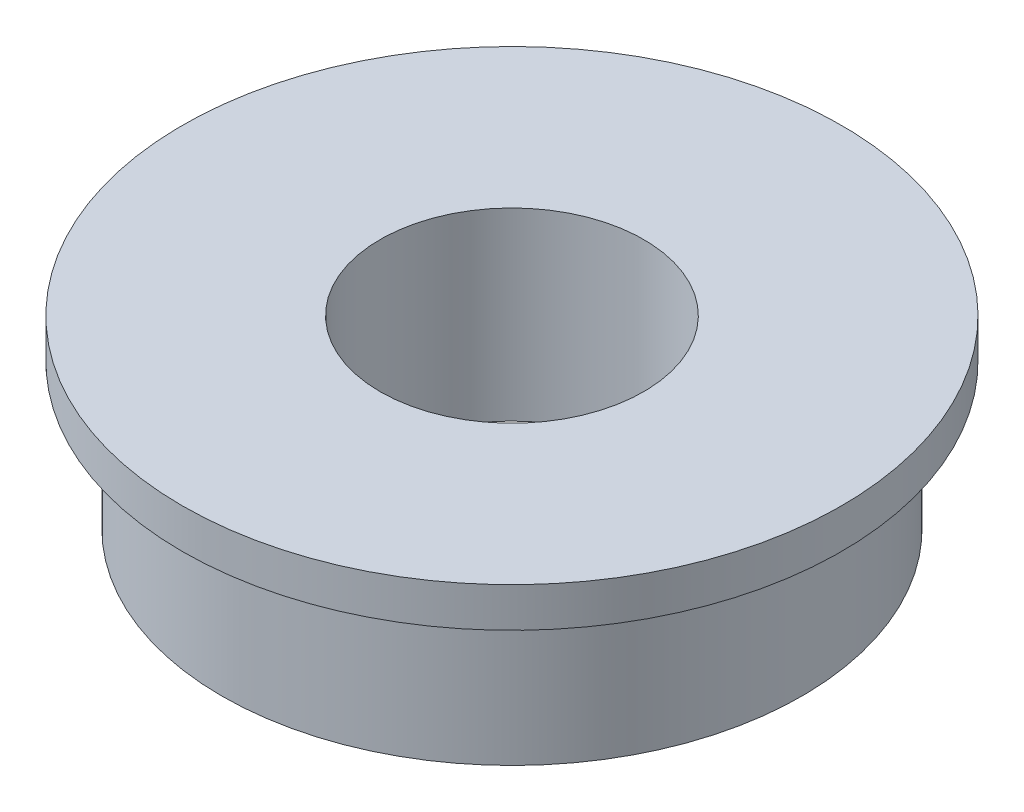
ISO-10303-21;
HEADER;
FILE_DESCRIPTION(('STEP AP214'),'2;1');
FILE_NAME('part.step','',(''),(''),'','','');
FILE_SCHEMA(('AUTOMOTIVE_DESIGN { 1 0 10303 214 1 1 1 1 }'));
ENDSEC;
DATA;
#1=APPLICATION_CONTEXT('core data for automotive mechanical design processes');
#2=APPLICATION_PROTOCOL_DEFINITION('international standard','automotive_design',2000,#1);
#3=PRODUCT_CONTEXT('',#1,'mechanical');
#4=PRODUCT('Part','Part','',(#3));
#5=PRODUCT_RELATED_PRODUCT_CATEGORY('part','',(#4));
#6=PRODUCT_DEFINITION_FORMATION('','',#4);
#7=PRODUCT_DEFINITION_CONTEXT('part definition',#1,'design');
#8=PRODUCT_DEFINITION('design','',#6,#7);
#9=PRODUCT_DEFINITION_SHAPE('','',#8);
#10=(LENGTH_UNIT() NAMED_UNIT(*) SI_UNIT(.MILLI.,.METRE.));
#11=(NAMED_UNIT(*) PLANE_ANGLE_UNIT() SI_UNIT($,.RADIAN.));
#12=(NAMED_UNIT(*) SI_UNIT($,.STERADIAN.) SOLID_ANGLE_UNIT());
#13=UNCERTAINTY_MEASURE_WITH_UNIT(LENGTH_MEASURE(1.E-05),#10,'distance_accuracy_value','');
#14=(GEOMETRIC_REPRESENTATION_CONTEXT(3) GLOBAL_UNCERTAINTY_ASSIGNED_CONTEXT((#13)) GLOBAL_UNIT_ASSIGNED_CONTEXT((#10,
#11,#12)) REPRESENTATION_CONTEXT('',''));
#15=CARTESIAN_POINT('',(0.,0.,0.));
#16=DIRECTION('',(0.,0.,1.));
#17=DIRECTION('',(1.,0.,0.));
#18=AXIS2_PLACEMENT_3D('',#15,#16,#17);
#19=CARTESIAN_POINT('',(0.,3.5,0.));
#20=DIRECTION('',(0.,-1.,0.));
#21=DIRECTION('',(0.,0.,-1.));
#22=AXIS2_PLACEMENT_3D('',#19,#20,#21);
#23=CYLINDRICAL_SURFACE('',#22,11.);
#24=CARTESIAN_POINT('',(0.,-3.5,0.));
#25=DIRECTION('',(0.,1.,0.));
#26=DIRECTION('',(0.,0.,1.));
#27=AXIS2_PLACEMENT_3D('',#24,#25,#26);
#28=CIRCLE('',#27,11.);
#29=CARTESIAN_POINT('',(0.,-3.5,11.));
#30=VERTEX_POINT('',#29);
#31=EDGE_CURVE('E38',#30,#30,#28,.T.);
#32=ORIENTED_EDGE('',*,*,#31,.T.);
#33=EDGE_LOOP('',(#32));
#34=FACE_BOUND('',#33,.T.);
#35=CARTESIAN_POINT('',(0.,2.,0.));
#36=DIRECTION('',(0.,1.,0.));
#37=DIRECTION('',(0.,0.,1.));
#38=AXIS2_PLACEMENT_3D('',#35,#36,#37);
#39=CIRCLE('',#38,11.);
#40=CARTESIAN_POINT('',(0.,2.,11.));
#41=VERTEX_POINT('',#40);
#42=EDGE_CURVE('E10',#41,#41,#39,.T.);
#43=ORIENTED_EDGE('',*,*,#42,.F.);
#44=EDGE_LOOP('',(#43));
#45=FACE_BOUND('',#44,.T.);
#46=ADVANCED_FACE('F32',(#34,#45),#23,.T.);
#47=CARTESIAN_POINT('',(0.,3.5,0.));
#48=DIRECTION('',(0.,1.,0.));
#49=DIRECTION('',(0.,0.,1.));
#50=AXIS2_PLACEMENT_3D('',#47,#48,#49);
#51=PLANE('',#50);
#52=CARTESIAN_POINT('',(0.,3.5,0.));
#53=DIRECTION('',(0.,1.,0.));
#54=DIRECTION('',(0.,0.,1.));
#55=AXIS2_PLACEMENT_3D('',#52,#53,#54);
#56=CIRCLE('',#55,5.);
#57=CARTESIAN_POINT('',(0.,3.5,5.));
#58=VERTEX_POINT('',#57);
#59=EDGE_CURVE('E42',#58,#58,#56,.T.);
#60=ORIENTED_EDGE('',*,*,#59,.F.);
#61=EDGE_LOOP('',(#60));
#62=FACE_BOUND('',#61,.T.);
#63=CARTESIAN_POINT('',(0.,3.5,0.));
#64=DIRECTION('',(0.,1.,0.));
#65=DIRECTION('',(0.,0.,1.));
#66=AXIS2_PLACEMENT_3D('',#63,#64,#65);
#67=CIRCLE('',#66,12.5);
#68=CARTESIAN_POINT('',(0.,3.5,12.5));
#69=VERTEX_POINT('',#68);
#70=EDGE_CURVE('E52',#69,#69,#67,.T.);
#71=ORIENTED_EDGE('',*,*,#70,.T.);
#72=EDGE_LOOP('',(#71));
#73=FACE_BOUND('',#72,.T.);
#74=ADVANCED_FACE('F70',(#62,#73),#51,.T.);
#75=CARTESIAN_POINT('',(0.,-3.5,0.));
#76=DIRECTION('',(0.,1.,0.));
#77=DIRECTION('',(0.,0.,1.));
#78=AXIS2_PLACEMENT_3D('',#75,#76,#77);
#79=PLANE('',#78);
#80=ORIENTED_EDGE('',*,*,#31,.F.);
#81=EDGE_LOOP('',(#80));
#82=FACE_BOUND('',#81,.T.);
#83=CARTESIAN_POINT('',(0.,-3.5,0.));
#84=DIRECTION('',(0.,1.,0.));
#85=DIRECTION('',(0.,0.,1.));
#86=AXIS2_PLACEMENT_3D('',#83,#84,#85);
#87=CIRCLE('',#86,5.);
#88=CARTESIAN_POINT('',(0.,-3.5,5.));
#89=VERTEX_POINT('',#88);
#90=EDGE_CURVE('E46',#89,#89,#87,.T.);
#91=ORIENTED_EDGE('',*,*,#90,.T.);
#92=EDGE_LOOP('',(#91));
#93=FACE_BOUND('',#92,.T.);
#94=ADVANCED_FACE('F74',(#82,#93),#79,.F.);
#95=CARTESIAN_POINT('',(0.,3.5,0.));
#96=DIRECTION('',(0.,-1.,0.));
#97=DIRECTION('',(0.,0.,-1.));
#98=AXIS2_PLACEMENT_3D('',#95,#96,#97);
#99=CYLINDRICAL_SURFACE('',#98,5.);
#100=ORIENTED_EDGE('',*,*,#59,.T.);
#101=EDGE_LOOP('',(#100));
#102=FACE_BOUND('',#101,.T.);
#103=ORIENTED_EDGE('',*,*,#90,.F.);
#104=EDGE_LOOP('',(#103));
#105=FACE_BOUND('',#104,.T.);
#106=ADVANCED_FACE('F67',(#102,#105),#99,.F.);
#107=CARTESIAN_POINT('',(0.,2.,0.));
#108=DIRECTION('',(0.,1.,0.));
#109=DIRECTION('',(0.,0.,1.));
#110=AXIS2_PLACEMENT_3D('',#107,#108,#109);
#111=CYLINDRICAL_SURFACE('',#110,12.5);
#112=CARTESIAN_POINT('',(0.,2.,0.));
#113=DIRECTION('',(0.,1.,0.));
#114=DIRECTION('',(0.,0.,1.));
#115=AXIS2_PLACEMENT_3D('',#112,#113,#114);
#116=CIRCLE('',#115,12.5);
#117=CARTESIAN_POINT('',(0.,2.,12.5));
#118=VERTEX_POINT('',#117);
#119=EDGE_CURVE('E50',#118,#118,#116,.T.);
#120=ORIENTED_EDGE('',*,*,#119,.T.);
#121=EDGE_LOOP('',(#120));
#122=FACE_BOUND('',#121,.T.);
#123=ORIENTED_EDGE('',*,*,#70,.F.);
#124=EDGE_LOOP('',(#123));
#125=FACE_BOUND('',#124,.T.);
#126=ADVANCED_FACE('F58',(#122,#125),#111,.T.);
#127=CARTESIAN_POINT('',(0.,2.,0.));
#128=DIRECTION('',(0.,1.,0.));
#129=DIRECTION('',(0.,0.,1.));
#130=AXIS2_PLACEMENT_3D('',#127,#128,#129);
#131=PLANE('',#130);
#132=ORIENTED_EDGE('',*,*,#42,.T.);
#133=EDGE_LOOP('',(#132));
#134=FACE_BOUND('',#133,.T.);
#135=ORIENTED_EDGE('',*,*,#119,.F.);
#136=EDGE_LOOP('',(#135));
#137=FACE_BOUND('',#136,.T.);
#138=ADVANCED_FACE('F61',(#134,#137),#131,.F.);
#139=CLOSED_SHELL('',(#46,#74,#94,#106,#126,#138));
#140=MANIFOLD_SOLID_BREP('B2',#139);
#141=ADVANCED_BREP_SHAPE_REPRESENTATION('',(#18,#140),#14);
#142=SHAPE_DEFINITION_REPRESENTATION(#9,#141);
ENDSEC;
END-ISO-10303-21;
